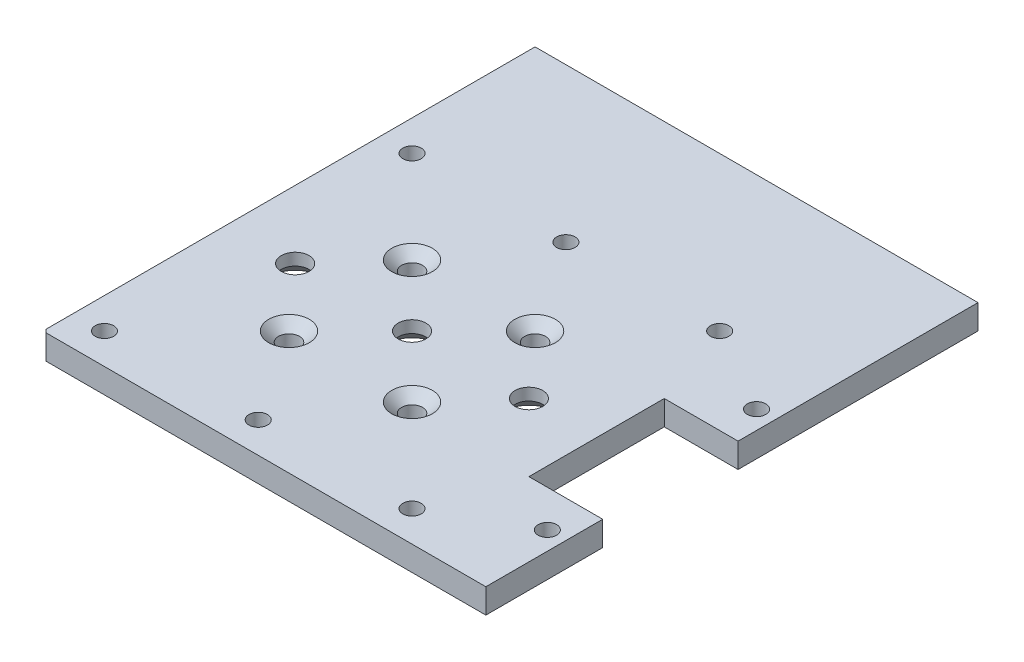
ISO-10303-21;
HEADER;
FILE_DESCRIPTION(('STEP AP214'),'2;1');
FILE_NAME('part.step','',(''),(''),'','','');
FILE_SCHEMA(('AUTOMOTIVE_DESIGN { 1 0 10303 214 1 1 1 1 }'));
ENDSEC;
DATA;
#1=APPLICATION_CONTEXT('core data for automotive mechanical design processes');
#2=APPLICATION_PROTOCOL_DEFINITION('international standard','automotive_design',2000,#1);
#3=PRODUCT_CONTEXT('',#1,'mechanical');
#4=PRODUCT('Part','Part','',(#3));
#5=PRODUCT_RELATED_PRODUCT_CATEGORY('part','',(#4));
#6=PRODUCT_DEFINITION_FORMATION('','',#4);
#7=PRODUCT_DEFINITION_CONTEXT('part definition',#1,'design');
#8=PRODUCT_DEFINITION('design','',#6,#7);
#9=PRODUCT_DEFINITION_SHAPE('','',#8);
#10=(LENGTH_UNIT() NAMED_UNIT(*) SI_UNIT(.MILLI.,.METRE.));
#11=(NAMED_UNIT(*) PLANE_ANGLE_UNIT() SI_UNIT($,.RADIAN.));
#12=(NAMED_UNIT(*) SI_UNIT($,.STERADIAN.) SOLID_ANGLE_UNIT());
#13=UNCERTAINTY_MEASURE_WITH_UNIT(LENGTH_MEASURE(1.E-05),#10,'distance_accuracy_value','');
#14=(GEOMETRIC_REPRESENTATION_CONTEXT(3) GLOBAL_UNCERTAINTY_ASSIGNED_CONTEXT((#13)) GLOBAL_UNIT_ASSIGNED_CONTEXT((#10,
#11,#12)) REPRESENTATION_CONTEXT('',''));
#15=CARTESIAN_POINT('',(0.,0.,0.));
#16=DIRECTION('',(0.,0.,1.));
#17=DIRECTION('',(1.,0.,0.));
#18=AXIS2_PLACEMENT_3D('',#15,#16,#17);
#19=CARTESIAN_POINT('',(30.,4.,30.));
#20=DIRECTION('',(-1.,0.,0.));
#21=DIRECTION('',(0.,0.,1.));
#22=AXIS2_PLACEMENT_3D('',#19,#20,#21);
#23=PLANE('',#22);
#24=DIRECTION('',(0.,1.,0.));
#25=VECTOR('',#24,1.);
#26=CARTESIAN_POINT('',(30.,-22.4722050542442,-11.));
#27=LINE('',#26,#25);
#28=CARTESIAN_POINT('',(30.,0.,-11.));
#29=VERTEX_POINT('',#28);
#30=CARTESIAN_POINT('',(30.,4.,-11.));
#31=VERTEX_POINT('',#30);
#32=EDGE_CURVE('E57',#29,#31,#27,.T.);
#33=ORIENTED_EDGE('',*,*,#32,.T.);
#34=DIRECTION('',(0.,0.,-1.));
#35=VECTOR('',#34,1.);
#36=CARTESIAN_POINT('',(30.,4.,30.));
#37=LINE('',#36,#35);
#38=CARTESIAN_POINT('',(30.,4.,11.));
#39=VERTEX_POINT('',#38);
#40=EDGE_CURVE('E281',#39,#31,#37,.T.);
#41=ORIENTED_EDGE('',*,*,#40,.F.);
#42=DIRECTION('',(0.,1.,0.));
#43=VECTOR('',#42,1.);
#44=CARTESIAN_POINT('',(30.,-22.4722050542442,11.));
#45=LINE('',#44,#43);
#46=CARTESIAN_POINT('',(30.,0.,11.));
#47=VERTEX_POINT('',#46);
#48=EDGE_CURVE('E173',#47,#39,#45,.T.);
#49=ORIENTED_EDGE('',*,*,#48,.F.);
#50=DIRECTION('',(0.,0.,-1.));
#51=VECTOR('',#50,1.);
#52=CARTESIAN_POINT('',(30.,0.,30.));
#53=LINE('',#52,#51);
#54=EDGE_CURVE('E62',#47,#29,#53,.T.);
#55=ORIENTED_EDGE('',*,*,#54,.T.);
#56=EDGE_LOOP('',(#33,#41,#49,#55));
#57=FACE_BOUND('',#56,.T.);
#58=ADVANCED_FACE('F41',(#57),#23,.F.);
#59=CARTESIAN_POINT('',(-30.,4.,30.));
#60=DIRECTION('',(1.,0.,0.));
#61=DIRECTION('',(0.,0.,-1.));
#62=AXIS2_PLACEMENT_3D('',#59,#60,#61);
#63=PLANE('',#62);
#64=DIRECTION('',(0.,0.,1.));
#65=VECTOR('',#64,1.);
#66=CARTESIAN_POINT('',(-30.,0.,30.));
#67=LINE('',#66,#65);
#68=CARTESIAN_POINT('',(-30.,0.,-50.));
#69=VERTEX_POINT('',#68);
#70=CARTESIAN_POINT('',(-30.,0.,29.5));
#71=VERTEX_POINT('',#70);
#72=EDGE_CURVE('E129',#69,#71,#67,.T.);
#73=ORIENTED_EDGE('',*,*,#72,.T.);
#74=DIRECTION('',(0.,1.,0.));
#75=VECTOR('',#74,1.);
#76=CARTESIAN_POINT('',(-30.,4.,29.5));
#77=LINE('',#76,#75);
#78=CARTESIAN_POINT('',(-30.,4.,29.5));
#79=VERTEX_POINT('',#78);
#80=EDGE_CURVE('E50',#71,#79,#77,.T.);
#81=ORIENTED_EDGE('',*,*,#80,.T.);
#82=DIRECTION('',(0.,0.,1.));
#83=VECTOR('',#82,1.);
#84=CARTESIAN_POINT('',(-30.,4.,30.));
#85=LINE('',#84,#83);
#86=CARTESIAN_POINT('',(-30.,4.,-50.));
#87=VERTEX_POINT('',#86);
#88=EDGE_CURVE('E283',#87,#79,#85,.T.);
#89=ORIENTED_EDGE('',*,*,#88,.F.);
#90=DIRECTION('',(0.,1.,0.));
#91=VECTOR('',#90,1.);
#92=CARTESIAN_POINT('',(-30.,4.,-50.));
#93=LINE('',#92,#91);
#94=EDGE_CURVE('E133',#69,#87,#93,.T.);
#95=ORIENTED_EDGE('',*,*,#94,.F.);
#96=EDGE_LOOP('',(#73,#81,#89,#95));
#97=FACE_BOUND('',#96,.T.);
#98=ADVANCED_FACE('F298',(#97),#63,.F.);
#99=CARTESIAN_POINT('',(-30.,4.,30.));
#100=DIRECTION('',(0.,0.,-1.));
#101=DIRECTION('',(-1.,0.,0.));
#102=AXIS2_PLACEMENT_3D('',#99,#100,#101);
#103=PLANE('',#102);
#104=DIRECTION('',(1.,0.,0.));
#105=VECTOR('',#104,1.);
#106=CARTESIAN_POINT('',(-30.,4.,30.));
#107=LINE('',#106,#105);
#108=CARTESIAN_POINT('',(-29.5,4.,30.));
#109=VERTEX_POINT('',#108);
#110=CARTESIAN_POINT('',(42.,4.,30.));
#111=VERTEX_POINT('',#110);
#112=EDGE_CURVE('E287',#109,#111,#107,.T.);
#113=ORIENTED_EDGE('',*,*,#112,.F.);
#114=DIRECTION('',(0.,-1.,0.));
#115=VECTOR('',#114,1.);
#116=CARTESIAN_POINT('',(-29.5,4.,30.));
#117=LINE('',#116,#115);
#118=CARTESIAN_POINT('',(-29.5,0.,30.));
#119=VERTEX_POINT('',#118);
#120=EDGE_CURVE('E289',#109,#119,#117,.T.);
#121=ORIENTED_EDGE('',*,*,#120,.T.);
#122=DIRECTION('',(1.,0.,0.));
#123=VECTOR('',#122,1.);
#124=CARTESIAN_POINT('',(-30.,0.,30.));
#125=LINE('',#124,#123);
#126=CARTESIAN_POINT('',(42.,0.,30.));
#127=VERTEX_POINT('',#126);
#128=EDGE_CURVE('E284',#119,#127,#125,.T.);
#129=ORIENTED_EDGE('',*,*,#128,.T.);
#130=DIRECTION('',(0.,1.,0.));
#131=VECTOR('',#130,1.);
#132=CARTESIAN_POINT('',(42.,-22.4722050542442,30.));
#133=LINE('',#132,#131);
#134=EDGE_CURVE('E167',#127,#111,#133,.T.);
#135=ORIENTED_EDGE('',*,*,#134,.T.);
#136=EDGE_LOOP('',(#113,#121,#129,#135));
#137=FACE_BOUND('',#136,.T.);
#138=ADVANCED_FACE('F307',(#137),#103,.F.);
#139=CARTESIAN_POINT('',(0.,4.,0.));
#140=DIRECTION('',(0.,-1.,0.));
#141=DIRECTION('',(0.,0.,-1.));
#142=AXIS2_PLACEMENT_3D('',#139,#140,#141);
#143=PLANE('',#142);
#144=CARTESIAN_POINT('',(25.,4.,-25.));
#145=DIRECTION('',(0.,1.,0.));
#146=DIRECTION('',(0.,0.,1.));
#147=AXIS2_PLACEMENT_3D('',#144,#145,#146);
#148=CIRCLE('',#147,1.50000000000001);
#149=CARTESIAN_POINT('',(25.,4.,-23.5));
#150=VERTEX_POINT('',#149);
#151=EDGE_CURVE('E170',#150,#150,#148,.T.);
#152=ORIENTED_EDGE('',*,*,#151,.F.);
#153=EDGE_LOOP('',(#152));
#154=FACE_BOUND('',#153,.T.);
#155=CARTESIAN_POINT('',(25.,4.,25.));
#156=DIRECTION('',(0.,1.,0.));
#157=DIRECTION('',(0.,0.,1.));
#158=AXIS2_PLACEMENT_3D('',#155,#156,#157);
#159=CIRCLE('',#158,1.50000000000001);
#160=CARTESIAN_POINT('',(25.,4.,26.5));
#161=VERTEX_POINT('',#160);
#162=EDGE_CURVE('E188',#161,#161,#159,.T.);
#163=ORIENTED_EDGE('',*,*,#162,.F.);
#164=EDGE_LOOP('',(#163));
#165=FACE_BOUND('',#164,.T.);
#166=CARTESIAN_POINT('',(0.,4.,25.));
#167=DIRECTION('',(0.,1.,0.));
#168=DIRECTION('',(0.,0.,1.));
#169=AXIS2_PLACEMENT_3D('',#166,#167,#168);
#170=CIRCLE('',#169,1.50000000000001);
#171=CARTESIAN_POINT('',(0.,4.,26.5));
#172=VERTEX_POINT('',#171);
#173=EDGE_CURVE('E194',#172,#172,#170,.T.);
#174=ORIENTED_EDGE('',*,*,#173,.F.);
#175=EDGE_LOOP('',(#174));
#176=FACE_BOUND('',#175,.T.);
#177=CARTESIAN_POINT('',(-25.,4.,25.));
#178=DIRECTION('',(0.,1.,0.));
#179=DIRECTION('',(0.,0.,1.));
#180=AXIS2_PLACEMENT_3D('',#177,#178,#179);
#181=CIRCLE('',#180,1.50000000000001);
#182=CARTESIAN_POINT('',(-25.,4.,26.5));
#183=VERTEX_POINT('',#182);
#184=EDGE_CURVE('E200',#183,#183,#181,.T.);
#185=ORIENTED_EDGE('',*,*,#184,.F.);
#186=EDGE_LOOP('',(#185));
#187=FACE_BOUND('',#186,.T.);
#188=CARTESIAN_POINT('',(-25.,4.,-25.));
#189=DIRECTION('',(0.,1.,0.));
#190=DIRECTION('',(0.,0.,1.));
#191=AXIS2_PLACEMENT_3D('',#188,#189,#190);
#192=CIRCLE('',#191,1.50000000000001);
#193=CARTESIAN_POINT('',(-25.,4.,-23.5));
#194=VERTEX_POINT('',#193);
#195=EDGE_CURVE('E206',#194,#194,#192,.T.);
#196=ORIENTED_EDGE('',*,*,#195,.F.);
#197=EDGE_LOOP('',(#196));
#198=FACE_BOUND('',#197,.T.);
#199=CARTESIAN_POINT('',(0.,4.,-25.));
#200=DIRECTION('',(0.,1.,0.));
#201=DIRECTION('',(0.,0.,1.));
#202=AXIS2_PLACEMENT_3D('',#199,#200,#201);
#203=CIRCLE('',#202,1.50000000000001);
#204=CARTESIAN_POINT('',(0.,4.,-23.5));
#205=VERTEX_POINT('',#204);
#206=EDGE_CURVE('E212',#205,#205,#203,.T.);
#207=ORIENTED_EDGE('',*,*,#206,.F.);
#208=EDGE_LOOP('',(#207));
#209=FACE_BOUND('',#208,.T.);
#210=CARTESIAN_POINT('',(-19.,4.,0.));
#211=DIRECTION('',(0.,-1.,0.));
#212=DIRECTION('',(0.,0.,-1.));
#213=AXIS2_PLACEMENT_3D('',#210,#211,#212);
#214=CIRCLE('',#213,2.25);
#215=CARTESIAN_POINT('',(-19.,4.,-2.25));
#216=VERTEX_POINT('',#215);
#217=EDGE_CURVE('E224',#216,#216,#214,.T.);
#218=ORIENTED_EDGE('',*,*,#217,.T.);
#219=EDGE_LOOP('',(#218));
#220=FACE_BOUND('',#219,.T.);
#221=CARTESIAN_POINT('',(0.,4.,0.));
#222=DIRECTION('',(0.,-1.,0.));
#223=DIRECTION('',(0.,0.,-1.));
#224=AXIS2_PLACEMENT_3D('',#221,#222,#223);
#225=CIRCLE('',#224,2.25);
#226=CARTESIAN_POINT('',(0.,4.,-2.25));
#227=VERTEX_POINT('',#226);
#228=EDGE_CURVE('E233',#227,#227,#225,.T.);
#229=ORIENTED_EDGE('',*,*,#228,.T.);
#230=EDGE_LOOP('',(#229));
#231=FACE_BOUND('',#230,.T.);
#232=CARTESIAN_POINT('',(19.,4.,0.));
#233=DIRECTION('',(0.,-1.,0.));
#234=DIRECTION('',(0.,0.,-1.));
#235=AXIS2_PLACEMENT_3D('',#232,#233,#234);
#236=CIRCLE('',#235,2.25);
#237=CARTESIAN_POINT('',(19.,4.,-2.25));
#238=VERTEX_POINT('',#237);
#239=EDGE_CURVE('E242',#238,#238,#236,.T.);
#240=ORIENTED_EDGE('',*,*,#239,.T.);
#241=EDGE_LOOP('',(#240));
#242=FACE_BOUND('',#241,.T.);
#243=CARTESIAN_POINT('',(-10.,4.,-10.));
#244=DIRECTION('',(0.,1.,0.));
#245=DIRECTION('',(0.,0.,1.));
#246=AXIS2_PLACEMENT_3D('',#243,#244,#245);
#247=CIRCLE('',#246,3.3);
#248=CARTESIAN_POINT('',(-10.,4.,-6.7));
#249=VERTEX_POINT('',#248);
#250=EDGE_CURVE('E245',#249,#249,#247,.T.);
#251=ORIENTED_EDGE('',*,*,#250,.F.);
#252=EDGE_LOOP('',(#251));
#253=FACE_BOUND('',#252,.T.);
#254=CARTESIAN_POINT('',(10.,4.,-10.0000000000006));
#255=DIRECTION('',(0.,1.,0.));
#256=DIRECTION('',(0.,0.,1.));
#257=AXIS2_PLACEMENT_3D('',#254,#255,#256);
#258=CIRCLE('',#257,3.3);
#259=CARTESIAN_POINT('',(10.,4.,-6.70000000000057));
#260=VERTEX_POINT('',#259);
#261=EDGE_CURVE('E254',#260,#260,#258,.T.);
#262=ORIENTED_EDGE('',*,*,#261,.F.);
#263=EDGE_LOOP('',(#262));
#264=FACE_BOUND('',#263,.T.);
#265=CARTESIAN_POINT('',(10.0000000000006,4.,9.99999999999944));
#266=DIRECTION('',(0.,1.,0.));
#267=DIRECTION('',(0.,0.,1.));
#268=AXIS2_PLACEMENT_3D('',#265,#266,#267);
#269=CIRCLE('',#268,3.3);
#270=CARTESIAN_POINT('',(10.0000000000006,4.,13.2999999999994));
#271=VERTEX_POINT('',#270);
#272=EDGE_CURVE('E263',#271,#271,#269,.T.);
#273=ORIENTED_EDGE('',*,*,#272,.F.);
#274=EDGE_LOOP('',(#273));
#275=FACE_BOUND('',#274,.T.);
#276=CARTESIAN_POINT('',(-9.99999999999944,4.,10.));
#277=DIRECTION('',(0.,1.,0.));
#278=DIRECTION('',(0.,0.,1.));
#279=AXIS2_PLACEMENT_3D('',#276,#277,#278);
#280=CIRCLE('',#279,3.3);
#281=CARTESIAN_POINT('',(-9.99999999999944,4.,13.3));
#282=VERTEX_POINT('',#281);
#283=EDGE_CURVE('E272',#282,#282,#280,.T.);
#284=ORIENTED_EDGE('',*,*,#283,.F.);
#285=EDGE_LOOP('',(#284));
#286=FACE_BOUND('',#285,.T.);
#287=ORIENTED_EDGE('',*,*,#88,.T.);
#288=DIRECTION('',(-0.707106781186548,0.,-0.707106781186548));
#289=VECTOR('',#288,1.);
#290=CARTESIAN_POINT('',(-29.5,4.,30.));
#291=LINE('',#290,#289);
#292=EDGE_CURVE('E11',#79,#109,#291,.F.);
#293=ORIENTED_EDGE('',*,*,#292,.T.);
#294=ORIENTED_EDGE('',*,*,#112,.T.);
#295=DIRECTION('',(0.,0.,-1.));
#296=VECTOR('',#295,1.);
#297=CARTESIAN_POINT('',(42.,4.,30.));
#298=LINE('',#297,#296);
#299=CARTESIAN_POINT('',(42.,4.,11.));
#300=VERTEX_POINT('',#299);
#301=EDGE_CURVE('E161',#111,#300,#298,.T.);
#302=ORIENTED_EDGE('',*,*,#301,.T.);
#303=DIRECTION('',(-1.,0.,0.));
#304=VECTOR('',#303,1.);
#305=CARTESIAN_POINT('',(30.,4.,11.));
#306=LINE('',#305,#304);
#307=EDGE_CURVE('E157',#300,#39,#306,.T.);
#308=ORIENTED_EDGE('',*,*,#307,.T.);
#309=ORIENTED_EDGE('',*,*,#40,.T.);
#310=DIRECTION('',(-1.,0.,0.));
#311=VECTOR('',#310,1.);
#312=CARTESIAN_POINT('',(30.,4.,-11.));
#313=LINE('',#312,#311);
#314=CARTESIAN_POINT('',(42.,4.,-11.));
#315=VERTEX_POINT('',#314);
#316=EDGE_CURVE('E147',#315,#31,#313,.T.);
#317=ORIENTED_EDGE('',*,*,#316,.F.);
#318=DIRECTION('',(0.,0.,1.));
#319=VECTOR('',#318,1.);
#320=CARTESIAN_POINT('',(42.,4.,-30.));
#321=LINE('',#320,#319);
#322=CARTESIAN_POINT('',(42.,4.,-50.));
#323=VERTEX_POINT('',#322);
#324=EDGE_CURVE('E150',#323,#315,#321,.T.);
#325=ORIENTED_EDGE('',*,*,#324,.F.);
#326=DIRECTION('',(1.,0.,0.));
#327=VECTOR('',#326,1.);
#328=CARTESIAN_POINT('',(42.,4.,-50.));
#329=LINE('',#328,#327);
#330=EDGE_CURVE('E138',#87,#323,#329,.T.);
#331=ORIENTED_EDGE('',*,*,#330,.F.);
#332=EDGE_LOOP('',(#287,#293,#294,#302,#308,#309,#317,#325,#331));
#333=FACE_BOUND('',#332,.T.);
#334=CARTESIAN_POINT('',(39.,4.,17.));
#335=DIRECTION('',(0.,1.,0.));
#336=DIRECTION('',(0.,0.,1.));
#337=AXIS2_PLACEMENT_3D('',#334,#335,#336);
#338=CIRCLE('',#337,1.5);
#339=CARTESIAN_POINT('',(39.,4.,18.5));
#340=VERTEX_POINT('',#339);
#341=EDGE_CURVE('E164',#340,#340,#338,.T.);
#342=ORIENTED_EDGE('',*,*,#341,.F.);
#343=EDGE_LOOP('',(#342));
#344=FACE_BOUND('',#343,.T.);
#345=CARTESIAN_POINT('',(39.,4.,-17.));
#346=DIRECTION('',(0.,-1.,0.));
#347=DIRECTION('',(0.,0.,-1.));
#348=AXIS2_PLACEMENT_3D('',#345,#346,#347);
#349=CIRCLE('',#348,1.5);
#350=CARTESIAN_POINT('',(39.,4.,-18.5));
#351=VERTEX_POINT('',#350);
#352=EDGE_CURVE('E120',#351,#351,#349,.T.);
#353=ORIENTED_EDGE('',*,*,#352,.T.);
#354=EDGE_LOOP('',(#353));
#355=FACE_BOUND('',#354,.T.);
#356=ADVANCED_FACE('F302',(#154,#165,#176,#187,#198,#209,#220,#231,#242,#253,#264,#275,#286,
#333,#344,#355),#143,.F.);
#357=CARTESIAN_POINT('',(0.,0.,0.));
#358=DIRECTION('',(0.,-1.,0.));
#359=DIRECTION('',(0.,0.,-1.));
#360=AXIS2_PLACEMENT_3D('',#357,#358,#359);
#361=PLANE('',#360);
#362=CARTESIAN_POINT('',(25.,0.,-25.));
#363=DIRECTION('',(0.,1.,0.));
#364=DIRECTION('',(0.,0.,1.));
#365=AXIS2_PLACEMENT_3D('',#362,#363,#364);
#366=CIRCLE('',#365,1.50000000000001);
#367=CARTESIAN_POINT('',(25.,0.,-23.5));
#368=VERTEX_POINT('',#367);
#369=EDGE_CURVE('E185',#368,#368,#366,.T.);
#370=ORIENTED_EDGE('',*,*,#369,.T.);
#371=EDGE_LOOP('',(#370));
#372=FACE_BOUND('',#371,.T.);
#373=CARTESIAN_POINT('',(25.,0.,25.));
#374=DIRECTION('',(0.,1.,0.));
#375=DIRECTION('',(0.,0.,1.));
#376=AXIS2_PLACEMENT_3D('',#373,#374,#375);
#377=CIRCLE('',#376,1.50000000000001);
#378=CARTESIAN_POINT('',(25.,0.,26.5));
#379=VERTEX_POINT('',#378);
#380=EDGE_CURVE('E191',#379,#379,#377,.T.);
#381=ORIENTED_EDGE('',*,*,#380,.T.);
#382=EDGE_LOOP('',(#381));
#383=FACE_BOUND('',#382,.T.);
#384=CARTESIAN_POINT('',(0.,0.,25.));
#385=DIRECTION('',(0.,1.,0.));
#386=DIRECTION('',(0.,0.,1.));
#387=AXIS2_PLACEMENT_3D('',#384,#385,#386);
#388=CIRCLE('',#387,1.50000000000001);
#389=CARTESIAN_POINT('',(0.,0.,26.5));
#390=VERTEX_POINT('',#389);
#391=EDGE_CURVE('E197',#390,#390,#388,.T.);
#392=ORIENTED_EDGE('',*,*,#391,.T.);
#393=EDGE_LOOP('',(#392));
#394=FACE_BOUND('',#393,.T.);
#395=CARTESIAN_POINT('',(-25.,0.,25.));
#396=DIRECTION('',(0.,1.,0.));
#397=DIRECTION('',(0.,0.,1.));
#398=AXIS2_PLACEMENT_3D('',#395,#396,#397);
#399=CIRCLE('',#398,1.50000000000001);
#400=CARTESIAN_POINT('',(-25.,0.,26.5));
#401=VERTEX_POINT('',#400);
#402=EDGE_CURVE('E203',#401,#401,#399,.T.);
#403=ORIENTED_EDGE('',*,*,#402,.T.);
#404=EDGE_LOOP('',(#403));
#405=FACE_BOUND('',#404,.T.);
#406=CARTESIAN_POINT('',(-25.,0.,-25.));
#407=DIRECTION('',(0.,1.,0.));
#408=DIRECTION('',(0.,0.,1.));
#409=AXIS2_PLACEMENT_3D('',#406,#407,#408);
#410=CIRCLE('',#409,1.50000000000001);
#411=CARTESIAN_POINT('',(-25.,0.,-23.5));
#412=VERTEX_POINT('',#411);
#413=EDGE_CURVE('E209',#412,#412,#410,.T.);
#414=ORIENTED_EDGE('',*,*,#413,.T.);
#415=EDGE_LOOP('',(#414));
#416=FACE_BOUND('',#415,.T.);
#417=CARTESIAN_POINT('',(0.,0.,-25.));
#418=DIRECTION('',(0.,1.,0.));
#419=DIRECTION('',(0.,0.,1.));
#420=AXIS2_PLACEMENT_3D('',#417,#418,#419);
#421=CIRCLE('',#420,1.50000000000001);
#422=CARTESIAN_POINT('',(0.,0.,-23.5));
#423=VERTEX_POINT('',#422);
#424=EDGE_CURVE('E215',#423,#423,#421,.T.);
#425=ORIENTED_EDGE('',*,*,#424,.T.);
#426=EDGE_LOOP('',(#425));
#427=FACE_BOUND('',#426,.T.);
#428=CARTESIAN_POINT('',(-19.,0.,0.));
#429=DIRECTION('',(0.,-1.,0.));
#430=DIRECTION('',(0.,0.,-1.));
#431=AXIS2_PLACEMENT_3D('',#428,#429,#430);
#432=CIRCLE('',#431,4.3);
#433=CARTESIAN_POINT('',(-19.,0.,-4.3));
#434=VERTEX_POINT('',#433);
#435=EDGE_CURVE('E218',#434,#434,#432,.T.);
#436=ORIENTED_EDGE('',*,*,#435,.F.);
#437=EDGE_LOOP('',(#436));
#438=FACE_BOUND('',#437,.T.);
#439=CARTESIAN_POINT('',(0.,0.,0.));
#440=DIRECTION('',(0.,-1.,0.));
#441=DIRECTION('',(0.,0.,-1.));
#442=AXIS2_PLACEMENT_3D('',#439,#440,#441);
#443=CIRCLE('',#442,4.3);
#444=CARTESIAN_POINT('',(0.,0.,-4.3));
#445=VERTEX_POINT('',#444);
#446=EDGE_CURVE('E227',#445,#445,#443,.T.);
#447=ORIENTED_EDGE('',*,*,#446,.F.);
#448=EDGE_LOOP('',(#447));
#449=FACE_BOUND('',#448,.T.);
#450=CARTESIAN_POINT('',(19.,0.,0.));
#451=DIRECTION('',(0.,-1.,0.));
#452=DIRECTION('',(0.,0.,-1.));
#453=AXIS2_PLACEMENT_3D('',#450,#451,#452);
#454=CIRCLE('',#453,4.3);
#455=CARTESIAN_POINT('',(19.,0.,-4.3));
#456=VERTEX_POINT('',#455);
#457=EDGE_CURVE('E236',#456,#456,#454,.T.);
#458=ORIENTED_EDGE('',*,*,#457,.F.);
#459=EDGE_LOOP('',(#458));
#460=FACE_BOUND('',#459,.T.);
#461=CARTESIAN_POINT('',(-10.,0.,-10.));
#462=DIRECTION('',(0.,1.,0.));
#463=DIRECTION('',(0.,0.,1.));
#464=AXIS2_PLACEMENT_3D('',#461,#462,#463);
#465=CIRCLE('',#464,1.7);
#466=CARTESIAN_POINT('',(-10.,0.,-8.3));
#467=VERTEX_POINT('',#466);
#468=EDGE_CURVE('E251',#467,#467,#465,.T.);
#469=ORIENTED_EDGE('',*,*,#468,.T.);
#470=EDGE_LOOP('',(#469));
#471=FACE_BOUND('',#470,.T.);
#472=CARTESIAN_POINT('',(10.,0.,-10.0000000000006));
#473=DIRECTION('',(0.,1.,0.));
#474=DIRECTION('',(0.,0.,1.));
#475=AXIS2_PLACEMENT_3D('',#472,#473,#474);
#476=CIRCLE('',#475,1.7);
#477=CARTESIAN_POINT('',(10.,0.,-8.30000000000057));
#478=VERTEX_POINT('',#477);
#479=EDGE_CURVE('E260',#478,#478,#476,.T.);
#480=ORIENTED_EDGE('',*,*,#479,.T.);
#481=EDGE_LOOP('',(#480));
#482=FACE_BOUND('',#481,.T.);
#483=CARTESIAN_POINT('',(10.0000000000006,0.,9.99999999999944));
#484=DIRECTION('',(0.,1.,0.));
#485=DIRECTION('',(0.,0.,1.));
#486=AXIS2_PLACEMENT_3D('',#483,#484,#485);
#487=CIRCLE('',#486,1.7);
#488=CARTESIAN_POINT('',(10.0000000000006,0.,11.6999999999994));
#489=VERTEX_POINT('',#488);
#490=EDGE_CURVE('E269',#489,#489,#487,.T.);
#491=ORIENTED_EDGE('',*,*,#490,.T.);
#492=EDGE_LOOP('',(#491));
#493=FACE_BOUND('',#492,.T.);
#494=CARTESIAN_POINT('',(-9.99999999999944,0.,10.));
#495=DIRECTION('',(0.,1.,0.));
#496=DIRECTION('',(0.,0.,1.));
#497=AXIS2_PLACEMENT_3D('',#494,#495,#496);
#498=CIRCLE('',#497,1.7);
#499=CARTESIAN_POINT('',(-9.99999999999944,0.,11.7));
#500=VERTEX_POINT('',#499);
#501=EDGE_CURVE('E278',#500,#500,#498,.T.);
#502=ORIENTED_EDGE('',*,*,#501,.T.);
#503=EDGE_LOOP('',(#502));
#504=FACE_BOUND('',#503,.T.);
#505=ORIENTED_EDGE('',*,*,#128,.F.);
#506=DIRECTION('',(0.707106781186548,0.,0.707106781186548));
#507=VECTOR('',#506,1.);
#508=CARTESIAN_POINT('',(-29.75,0.,29.75));
#509=LINE('',#508,#507);
#510=EDGE_CURVE('E295',#119,#71,#509,.F.);
#511=ORIENTED_EDGE('',*,*,#510,.T.);
#512=ORIENTED_EDGE('',*,*,#72,.F.);
#513=DIRECTION('',(-1.,0.,0.));
#514=VECTOR('',#513,1.);
#515=CARTESIAN_POINT('',(42.,0.,-50.));
#516=LINE('',#515,#514);
#517=CARTESIAN_POINT('',(42.,0.,-50.));
#518=VERTEX_POINT('',#517);
#519=EDGE_CURVE('E124',#518,#69,#516,.T.);
#520=ORIENTED_EDGE('',*,*,#519,.F.);
#521=DIRECTION('',(0.,0.,1.));
#522=VECTOR('',#521,1.);
#523=CARTESIAN_POINT('',(42.,0.,-30.));
#524=LINE('',#523,#522);
#525=CARTESIAN_POINT('',(42.,0.,-11.));
#526=VERTEX_POINT('',#525);
#527=EDGE_CURVE('E110',#518,#526,#524,.T.);
#528=ORIENTED_EDGE('',*,*,#527,.T.);
#529=DIRECTION('',(-1.,0.,0.));
#530=VECTOR('',#529,1.);
#531=CARTESIAN_POINT('',(30.,0.,-11.));
#532=LINE('',#531,#530);
#533=EDGE_CURVE('E121',#526,#29,#532,.T.);
#534=ORIENTED_EDGE('',*,*,#533,.T.);
#535=ORIENTED_EDGE('',*,*,#54,.F.);
#536=DIRECTION('',(-1.,0.,0.));
#537=VECTOR('',#536,1.);
#538=CARTESIAN_POINT('',(30.,0.,11.));
#539=LINE('',#538,#537);
#540=CARTESIAN_POINT('',(42.,0.,11.));
#541=VERTEX_POINT('',#540);
#542=EDGE_CURVE('E153',#541,#47,#539,.T.);
#543=ORIENTED_EDGE('',*,*,#542,.F.);
#544=DIRECTION('',(0.,0.,-1.));
#545=VECTOR('',#544,1.);
#546=CARTESIAN_POINT('',(42.,0.,30.));
#547=LINE('',#546,#545);
#548=EDGE_CURVE('E174',#127,#541,#547,.T.);
#549=ORIENTED_EDGE('',*,*,#548,.F.);
#550=EDGE_LOOP('',(#505,#511,#512,#520,#528,#534,#535,#543,#549));
#551=FACE_BOUND('',#550,.T.);
#552=CARTESIAN_POINT('',(39.,0.,17.));
#553=DIRECTION('',(0.,-1.,0.));
#554=DIRECTION('',(0.,0.,-1.));
#555=AXIS2_PLACEMENT_3D('',#552,#553,#554);
#556=CIRCLE('',#555,1.5);
#557=CARTESIAN_POINT('',(39.,0.,15.5));
#558=VERTEX_POINT('',#557);
#559=EDGE_CURVE('E160',#558,#558,#556,.F.);
#560=ORIENTED_EDGE('',*,*,#559,.T.);
#561=EDGE_LOOP('',(#560));
#562=FACE_BOUND('',#561,.T.);
#563=CARTESIAN_POINT('',(39.,0.,-17.));
#564=DIRECTION('',(0.,-1.,0.));
#565=DIRECTION('',(0.,0.,-1.));
#566=AXIS2_PLACEMENT_3D('',#563,#564,#565);
#567=CIRCLE('',#566,1.5);
#568=CARTESIAN_POINT('',(39.,0.,-18.5));
#569=VERTEX_POINT('',#568);
#570=EDGE_CURVE('E143',#569,#569,#567,.T.);
#571=ORIENTED_EDGE('',*,*,#570,.F.);
#572=EDGE_LOOP('',(#571));
#573=FACE_BOUND('',#572,.T.);
#574=ADVANCED_FACE('F126',(#372,#383,#394,#405,#416,#427,#438,#449,#460,#471,#482,#493,#504,
#551,#562,#573),#361,.T.);
#575=CARTESIAN_POINT('',(-9.99999999999944,4.,10.));
#576=DIRECTION('',(0.,1.,0.));
#577=DIRECTION('',(0.,0.,1.));
#578=AXIS2_PLACEMENT_3D('',#575,#576,#577);
#579=CYLINDRICAL_SURFACE('',#578,1.7);
#580=ORIENTED_EDGE('',*,*,#501,.F.);
#581=EDGE_LOOP('',(#580));
#582=FACE_BOUND('',#581,.T.);
#583=CARTESIAN_POINT('',(-9.99999999999944,2.4,10.));
#584=DIRECTION('',(0.,1.,0.));
#585=DIRECTION('',(0.,0.,1.));
#586=AXIS2_PLACEMENT_3D('',#583,#584,#585);
#587=CIRCLE('',#586,1.7);
#588=CARTESIAN_POINT('',(-9.99999999999944,2.4,11.7));
#589=VERTEX_POINT('',#588);
#590=EDGE_CURVE('E275',#589,#589,#587,.T.);
#591=ORIENTED_EDGE('',*,*,#590,.T.);
#592=EDGE_LOOP('',(#591));
#593=FACE_BOUND('',#592,.T.);
#594=ADVANCED_FACE('F340',(#582,#593),#579,.F.);
#595=CARTESIAN_POINT('',(-9.99999999999944,4.,10.));
#596=DIRECTION('',(0.,1.,0.));
#597=DIRECTION('',(0.,0.,1.));
#598=AXIS2_PLACEMENT_3D('',#595,#596,#597);
#599=CONICAL_SURFACE('',#598,3.3,0.785398163397449);
#600=ORIENTED_EDGE('',*,*,#590,.F.);
#601=EDGE_LOOP('',(#600));
#602=FACE_BOUND('',#601,.T.);
#603=ORIENTED_EDGE('',*,*,#283,.T.);
#604=EDGE_LOOP('',(#603));
#605=FACE_BOUND('',#604,.T.);
#606=ADVANCED_FACE('F347',(#602,#605),#599,.F.);
#607=CARTESIAN_POINT('',(10.0000000000006,4.,9.99999999999944));
#608=DIRECTION('',(0.,1.,0.));
#609=DIRECTION('',(0.,0.,1.));
#610=AXIS2_PLACEMENT_3D('',#607,#608,#609);
#611=CYLINDRICAL_SURFACE('',#610,1.7);
#612=ORIENTED_EDGE('',*,*,#490,.F.);
#613=EDGE_LOOP('',(#612));
#614=FACE_BOUND('',#613,.T.);
#615=CARTESIAN_POINT('',(10.0000000000006,2.4,9.99999999999944));
#616=DIRECTION('',(0.,1.,0.));
#617=DIRECTION('',(0.,0.,1.));
#618=AXIS2_PLACEMENT_3D('',#615,#616,#617);
#619=CIRCLE('',#618,1.7);
#620=CARTESIAN_POINT('',(10.0000000000006,2.4,11.6999999999994));
#621=VERTEX_POINT('',#620);
#622=EDGE_CURVE('E266',#621,#621,#619,.T.);
#623=ORIENTED_EDGE('',*,*,#622,.T.);
#624=EDGE_LOOP('',(#623));
#625=FACE_BOUND('',#624,.T.);
#626=ADVANCED_FACE('F351',(#614,#625),#611,.F.);
#627=CARTESIAN_POINT('',(10.0000000000006,4.,9.99999999999944));
#628=DIRECTION('',(0.,1.,0.));
#629=DIRECTION('',(0.,0.,1.));
#630=AXIS2_PLACEMENT_3D('',#627,#628,#629);
#631=CONICAL_SURFACE('',#630,3.3,0.785398163397449);
#632=ORIENTED_EDGE('',*,*,#622,.F.);
#633=EDGE_LOOP('',(#632));
#634=FACE_BOUND('',#633,.T.);
#635=ORIENTED_EDGE('',*,*,#272,.T.);
#636=EDGE_LOOP('',(#635));
#637=FACE_BOUND('',#636,.T.);
#638=ADVANCED_FACE('F355',(#634,#637),#631,.F.);
#639=CARTESIAN_POINT('',(10.,4.,-10.0000000000006));
#640=DIRECTION('',(0.,1.,0.));
#641=DIRECTION('',(0.,0.,1.));
#642=AXIS2_PLACEMENT_3D('',#639,#640,#641);
#643=CYLINDRICAL_SURFACE('',#642,1.7);
#644=ORIENTED_EDGE('',*,*,#479,.F.);
#645=EDGE_LOOP('',(#644));
#646=FACE_BOUND('',#645,.T.);
#647=CARTESIAN_POINT('',(10.,2.4,-10.0000000000006));
#648=DIRECTION('',(0.,1.,0.));
#649=DIRECTION('',(0.,0.,1.));
#650=AXIS2_PLACEMENT_3D('',#647,#648,#649);
#651=CIRCLE('',#650,1.7);
#652=CARTESIAN_POINT('',(10.,2.4,-8.30000000000057));
#653=VERTEX_POINT('',#652);
#654=EDGE_CURVE('E257',#653,#653,#651,.T.);
#655=ORIENTED_EDGE('',*,*,#654,.T.);
#656=EDGE_LOOP('',(#655));
#657=FACE_BOUND('',#656,.T.);
#658=ADVANCED_FACE('F359',(#646,#657),#643,.F.);
#659=CARTESIAN_POINT('',(10.,4.,-10.0000000000006));
#660=DIRECTION('',(0.,1.,0.));
#661=DIRECTION('',(0.,0.,1.));
#662=AXIS2_PLACEMENT_3D('',#659,#660,#661);
#663=CONICAL_SURFACE('',#662,3.3,0.785398163397449);
#664=ORIENTED_EDGE('',*,*,#654,.F.);
#665=EDGE_LOOP('',(#664));
#666=FACE_BOUND('',#665,.T.);
#667=ORIENTED_EDGE('',*,*,#261,.T.);
#668=EDGE_LOOP('',(#667));
#669=FACE_BOUND('',#668,.T.);
#670=ADVANCED_FACE('F363',(#666,#669),#663,.F.);
#671=CARTESIAN_POINT('',(-10.,4.,-10.));
#672=DIRECTION('',(0.,1.,0.));
#673=DIRECTION('',(0.,0.,1.));
#674=AXIS2_PLACEMENT_3D('',#671,#672,#673);
#675=CYLINDRICAL_SURFACE('',#674,1.7);
#676=ORIENTED_EDGE('',*,*,#468,.F.);
#677=EDGE_LOOP('',(#676));
#678=FACE_BOUND('',#677,.T.);
#679=CARTESIAN_POINT('',(-10.,2.4,-10.));
#680=DIRECTION('',(0.,1.,0.));
#681=DIRECTION('',(0.,0.,1.));
#682=AXIS2_PLACEMENT_3D('',#679,#680,#681);
#683=CIRCLE('',#682,1.7);
#684=CARTESIAN_POINT('',(-10.,2.4,-8.3));
#685=VERTEX_POINT('',#684);
#686=EDGE_CURVE('E248',#685,#685,#683,.T.);
#687=ORIENTED_EDGE('',*,*,#686,.T.);
#688=EDGE_LOOP('',(#687));
#689=FACE_BOUND('',#688,.T.);
#690=ADVANCED_FACE('F367',(#678,#689),#675,.F.);
#691=CARTESIAN_POINT('',(-10.,4.,-10.));
#692=DIRECTION('',(0.,1.,0.));
#693=DIRECTION('',(0.,0.,1.));
#694=AXIS2_PLACEMENT_3D('',#691,#692,#693);
#695=CONICAL_SURFACE('',#694,3.3,0.785398163397449);
#696=ORIENTED_EDGE('',*,*,#686,.F.);
#697=EDGE_LOOP('',(#696));
#698=FACE_BOUND('',#697,.T.);
#699=ORIENTED_EDGE('',*,*,#250,.T.);
#700=EDGE_LOOP('',(#699));
#701=FACE_BOUND('',#700,.T.);
#702=ADVANCED_FACE('F371',(#698,#701),#695,.F.);
#703=CARTESIAN_POINT('',(19.,0.,0.));
#704=DIRECTION('',(0.,-1.,0.));
#705=DIRECTION('',(0.,0.,-1.));
#706=AXIS2_PLACEMENT_3D('',#703,#704,#705);
#707=CYLINDRICAL_SURFACE('',#706,2.25);
#708=ORIENTED_EDGE('',*,*,#239,.F.);
#709=EDGE_LOOP('',(#708));
#710=FACE_BOUND('',#709,.T.);
#711=CARTESIAN_POINT('',(19.,2.05,0.));
#712=DIRECTION('',(0.,-1.,0.));
#713=DIRECTION('',(0.,0.,-1.));
#714=AXIS2_PLACEMENT_3D('',#711,#712,#713);
#715=CIRCLE('',#714,2.25);
#716=CARTESIAN_POINT('',(19.,2.05,-2.25));
#717=VERTEX_POINT('',#716);
#718=EDGE_CURVE('E239',#717,#717,#715,.T.);
#719=ORIENTED_EDGE('',*,*,#718,.T.);
#720=EDGE_LOOP('',(#719));
#721=FACE_BOUND('',#720,.T.);
#722=ADVANCED_FACE('F375',(#710,#721),#707,.F.);
#723=CARTESIAN_POINT('',(19.,0.,0.));
#724=DIRECTION('',(0.,-1.,0.));
#725=DIRECTION('',(0.,0.,-1.));
#726=AXIS2_PLACEMENT_3D('',#723,#724,#725);
#727=CONICAL_SURFACE('',#726,4.3,0.785398163397449);
#728=ORIENTED_EDGE('',*,*,#718,.F.);
#729=EDGE_LOOP('',(#728));
#730=FACE_BOUND('',#729,.T.);
#731=ORIENTED_EDGE('',*,*,#457,.T.);
#732=EDGE_LOOP('',(#731));
#733=FACE_BOUND('',#732,.T.);
#734=ADVANCED_FACE('F379',(#730,#733),#727,.F.);
#735=CARTESIAN_POINT('',(0.,0.,0.));
#736=DIRECTION('',(0.,-1.,0.));
#737=DIRECTION('',(0.,0.,-1.));
#738=AXIS2_PLACEMENT_3D('',#735,#736,#737);
#739=CYLINDRICAL_SURFACE('',#738,2.25);
#740=ORIENTED_EDGE('',*,*,#228,.F.);
#741=EDGE_LOOP('',(#740));
#742=FACE_BOUND('',#741,.T.);
#743=CARTESIAN_POINT('',(0.,2.05,0.));
#744=DIRECTION('',(0.,-1.,0.));
#745=DIRECTION('',(0.,0.,-1.));
#746=AXIS2_PLACEMENT_3D('',#743,#744,#745);
#747=CIRCLE('',#746,2.25);
#748=CARTESIAN_POINT('',(0.,2.05,-2.25));
#749=VERTEX_POINT('',#748);
#750=EDGE_CURVE('E230',#749,#749,#747,.T.);
#751=ORIENTED_EDGE('',*,*,#750,.T.);
#752=EDGE_LOOP('',(#751));
#753=FACE_BOUND('',#752,.T.);
#754=ADVANCED_FACE('F383',(#742,#753),#739,.F.);
#755=CARTESIAN_POINT('',(0.,0.,0.));
#756=DIRECTION('',(0.,-1.,0.));
#757=DIRECTION('',(0.,0.,-1.));
#758=AXIS2_PLACEMENT_3D('',#755,#756,#757);
#759=CONICAL_SURFACE('',#758,4.3,0.785398163397449);
#760=ORIENTED_EDGE('',*,*,#750,.F.);
#761=EDGE_LOOP('',(#760));
#762=FACE_BOUND('',#761,.T.);
#763=ORIENTED_EDGE('',*,*,#446,.T.);
#764=EDGE_LOOP('',(#763));
#765=FACE_BOUND('',#764,.T.);
#766=ADVANCED_FACE('F387',(#762,#765),#759,.F.);
#767=CARTESIAN_POINT('',(-19.,0.,0.));
#768=DIRECTION('',(0.,-1.,0.));
#769=DIRECTION('',(0.,0.,-1.));
#770=AXIS2_PLACEMENT_3D('',#767,#768,#769);
#771=CYLINDRICAL_SURFACE('',#770,2.25);
#772=ORIENTED_EDGE('',*,*,#217,.F.);
#773=EDGE_LOOP('',(#772));
#774=FACE_BOUND('',#773,.T.);
#775=CARTESIAN_POINT('',(-19.,2.05,0.));
#776=DIRECTION('',(0.,-1.,0.));
#777=DIRECTION('',(0.,0.,-1.));
#778=AXIS2_PLACEMENT_3D('',#775,#776,#777);
#779=CIRCLE('',#778,2.25);
#780=CARTESIAN_POINT('',(-19.,2.05,-2.25));
#781=VERTEX_POINT('',#780);
#782=EDGE_CURVE('E221',#781,#781,#779,.T.);
#783=ORIENTED_EDGE('',*,*,#782,.T.);
#784=EDGE_LOOP('',(#783));
#785=FACE_BOUND('',#784,.T.);
#786=ADVANCED_FACE('F391',(#774,#785),#771,.F.);
#787=CARTESIAN_POINT('',(-19.,0.,0.));
#788=DIRECTION('',(0.,-1.,0.));
#789=DIRECTION('',(0.,0.,-1.));
#790=AXIS2_PLACEMENT_3D('',#787,#788,#789);
#791=CONICAL_SURFACE('',#790,4.3,0.785398163397449);
#792=ORIENTED_EDGE('',*,*,#782,.F.);
#793=EDGE_LOOP('',(#792));
#794=FACE_BOUND('',#793,.T.);
#795=ORIENTED_EDGE('',*,*,#435,.T.);
#796=EDGE_LOOP('',(#795));
#797=FACE_BOUND('',#796,.T.);
#798=ADVANCED_FACE('F395',(#794,#797),#791,.F.);
#799=CARTESIAN_POINT('',(0.,4.,-25.));
#800=DIRECTION('',(0.,1.,0.));
#801=DIRECTION('',(0.,0.,1.));
#802=AXIS2_PLACEMENT_3D('',#799,#800,#801);
#803=CYLINDRICAL_SURFACE('',#802,1.50000000000001);
#804=ORIENTED_EDGE('',*,*,#424,.F.);
#805=EDGE_LOOP('',(#804));
#806=FACE_BOUND('',#805,.T.);
#807=ORIENTED_EDGE('',*,*,#206,.T.);
#808=EDGE_LOOP('',(#807));
#809=FACE_BOUND('',#808,.T.);
#810=ADVANCED_FACE('F399',(#806,#809),#803,.F.);
#811=CARTESIAN_POINT('',(-25.,4.,-25.));
#812=DIRECTION('',(0.,1.,0.));
#813=DIRECTION('',(0.,0.,1.));
#814=AXIS2_PLACEMENT_3D('',#811,#812,#813);
#815=CYLINDRICAL_SURFACE('',#814,1.50000000000001);
#816=ORIENTED_EDGE('',*,*,#413,.F.);
#817=EDGE_LOOP('',(#816));
#818=FACE_BOUND('',#817,.T.);
#819=ORIENTED_EDGE('',*,*,#195,.T.);
#820=EDGE_LOOP('',(#819));
#821=FACE_BOUND('',#820,.T.);
#822=ADVANCED_FACE('F403',(#818,#821),#815,.F.);
#823=CARTESIAN_POINT('',(-25.,4.,25.));
#824=DIRECTION('',(0.,1.,0.));
#825=DIRECTION('',(0.,0.,1.));
#826=AXIS2_PLACEMENT_3D('',#823,#824,#825);
#827=CYLINDRICAL_SURFACE('',#826,1.50000000000001);
#828=ORIENTED_EDGE('',*,*,#402,.F.);
#829=EDGE_LOOP('',(#828));
#830=FACE_BOUND('',#829,.T.);
#831=ORIENTED_EDGE('',*,*,#184,.T.);
#832=EDGE_LOOP('',(#831));
#833=FACE_BOUND('',#832,.T.);
#834=ADVANCED_FACE('F407',(#830,#833),#827,.F.);
#835=CARTESIAN_POINT('',(0.,4.,25.));
#836=DIRECTION('',(0.,1.,0.));
#837=DIRECTION('',(0.,0.,1.));
#838=AXIS2_PLACEMENT_3D('',#835,#836,#837);
#839=CYLINDRICAL_SURFACE('',#838,1.50000000000001);
#840=ORIENTED_EDGE('',*,*,#391,.F.);
#841=EDGE_LOOP('',(#840));
#842=FACE_BOUND('',#841,.T.);
#843=ORIENTED_EDGE('',*,*,#173,.T.);
#844=EDGE_LOOP('',(#843));
#845=FACE_BOUND('',#844,.T.);
#846=ADVANCED_FACE('F411',(#842,#845),#839,.F.);
#847=CARTESIAN_POINT('',(25.,4.,25.));
#848=DIRECTION('',(0.,1.,0.));
#849=DIRECTION('',(0.,0.,1.));
#850=AXIS2_PLACEMENT_3D('',#847,#848,#849);
#851=CYLINDRICAL_SURFACE('',#850,1.50000000000001);
#852=ORIENTED_EDGE('',*,*,#380,.F.);
#853=EDGE_LOOP('',(#852));
#854=FACE_BOUND('',#853,.T.);
#855=ORIENTED_EDGE('',*,*,#162,.T.);
#856=EDGE_LOOP('',(#855));
#857=FACE_BOUND('',#856,.T.);
#858=ADVANCED_FACE('F415',(#854,#857),#851,.F.);
#859=CARTESIAN_POINT('',(25.,4.,-25.));
#860=DIRECTION('',(0.,1.,0.));
#861=DIRECTION('',(0.,0.,1.));
#862=AXIS2_PLACEMENT_3D('',#859,#860,#861);
#863=CYLINDRICAL_SURFACE('',#862,1.50000000000001);
#864=ORIENTED_EDGE('',*,*,#369,.F.);
#865=EDGE_LOOP('',(#864));
#866=FACE_BOUND('',#865,.T.);
#867=ORIENTED_EDGE('',*,*,#151,.T.);
#868=EDGE_LOOP('',(#867));
#869=FACE_BOUND('',#868,.T.);
#870=ADVANCED_FACE('F419',(#866,#869),#863,.F.);
#871=CARTESIAN_POINT('',(30.,-22.4722050542442,11.));
#872=DIRECTION('',(0.,0.,-1.));
#873=DIRECTION('',(-1.,0.,0.));
#874=AXIS2_PLACEMENT_3D('',#871,#872,#873);
#875=PLANE('',#874);
#876=DIRECTION('',(0.,1.,0.));
#877=VECTOR('',#876,1.);
#878=CARTESIAN_POINT('',(42.,-22.4722050542442,11.));
#879=LINE('',#878,#877);
#880=EDGE_CURVE('E177',#541,#300,#879,.T.);
#881=ORIENTED_EDGE('',*,*,#880,.F.);
#882=ORIENTED_EDGE('',*,*,#542,.T.);
#883=ORIENTED_EDGE('',*,*,#48,.T.);
#884=ORIENTED_EDGE('',*,*,#307,.F.);
#885=EDGE_LOOP('',(#881,#882,#883,#884));
#886=FACE_BOUND('',#885,.T.);
#887=ADVANCED_FACE('F316',(#886),#875,.T.);
#888=CARTESIAN_POINT('',(42.,-22.4722050542442,30.));
#889=DIRECTION('',(1.,0.,0.));
#890=DIRECTION('',(0.,0.,-1.));
#891=AXIS2_PLACEMENT_3D('',#888,#889,#890);
#892=PLANE('',#891);
#893=ORIENTED_EDGE('',*,*,#134,.F.);
#894=ORIENTED_EDGE('',*,*,#548,.T.);
#895=ORIENTED_EDGE('',*,*,#880,.T.);
#896=ORIENTED_EDGE('',*,*,#301,.F.);
#897=EDGE_LOOP('',(#893,#894,#895,#896));
#898=FACE_BOUND('',#897,.T.);
#899=ADVANCED_FACE('F313',(#898),#892,.T.);
#900=CARTESIAN_POINT('',(39.,-22.4722050542442,17.));
#901=DIRECTION('',(0.,1.,0.));
#902=DIRECTION('',(0.,0.,1.));
#903=AXIS2_PLACEMENT_3D('',#900,#901,#902);
#904=CYLINDRICAL_SURFACE('',#903,1.5);
#905=ORIENTED_EDGE('',*,*,#341,.T.);
#906=EDGE_LOOP('',(#905));
#907=FACE_BOUND('',#906,.T.);
#908=ORIENTED_EDGE('',*,*,#559,.F.);
#909=EDGE_LOOP('',(#908));
#910=FACE_BOUND('',#909,.T.);
#911=ADVANCED_FACE('F328',(#907,#910),#904,.F.);
#912=CARTESIAN_POINT('',(-29.5,4.,30.));
#913=DIRECTION('',(0.707106781186547,0.,-0.707106781186547));
#914=DIRECTION('',(0.,-1.,0.));
#915=AXIS2_PLACEMENT_3D('',#912,#913,#914);
#916=PLANE('',#915);
#917=ORIENTED_EDGE('',*,*,#292,.F.);
#918=ORIENTED_EDGE('',*,*,#80,.F.);
#919=ORIENTED_EDGE('',*,*,#510,.F.);
#920=ORIENTED_EDGE('',*,*,#120,.F.);
#921=EDGE_LOOP('',(#917,#918,#919,#920));
#922=FACE_BOUND('',#921,.T.);
#923=ADVANCED_FACE('F44',(#922),#916,.F.);
#924=CARTESIAN_POINT('',(30.,-22.4722050542442,-11.));
#925=DIRECTION('',(0.,0.,-1.));
#926=DIRECTION('',(-1.,0.,0.));
#927=AXIS2_PLACEMENT_3D('',#924,#925,#926);
#928=PLANE('',#927);
#929=ORIENTED_EDGE('',*,*,#533,.F.);
#930=DIRECTION('',(0.,1.,0.));
#931=VECTOR('',#930,1.);
#932=CARTESIAN_POINT('',(42.,-22.4722050542442,-11.));
#933=LINE('',#932,#931);
#934=EDGE_CURVE('E116',#526,#315,#933,.T.);
#935=ORIENTED_EDGE('',*,*,#934,.T.);
#936=ORIENTED_EDGE('',*,*,#316,.T.);
#937=ORIENTED_EDGE('',*,*,#32,.F.);
#938=EDGE_LOOP('',(#929,#935,#936,#937));
#939=FACE_BOUND('',#938,.T.);
#940=ADVANCED_FACE('F318',(#939),#928,.F.);
#941=CARTESIAN_POINT('',(42.,-22.4722050542442,-30.));
#942=DIRECTION('',(-1.,0.,0.));
#943=DIRECTION('',(0.,0.,1.));
#944=AXIS2_PLACEMENT_3D('',#941,#942,#943);
#945=PLANE('',#944);
#946=ORIENTED_EDGE('',*,*,#527,.F.);
#947=DIRECTION('',(0.,-1.,0.));
#948=VECTOR('',#947,1.);
#949=CARTESIAN_POINT('',(42.,4.,-50.));
#950=LINE('',#949,#948);
#951=EDGE_CURVE('E115',#323,#518,#950,.T.);
#952=ORIENTED_EDGE('',*,*,#951,.F.);
#953=ORIENTED_EDGE('',*,*,#324,.T.);
#954=ORIENTED_EDGE('',*,*,#934,.F.);
#955=EDGE_LOOP('',(#946,#952,#953,#954));
#956=FACE_BOUND('',#955,.T.);
#957=ADVANCED_FACE('F112',(#956),#945,.F.);
#958=CARTESIAN_POINT('',(39.,-22.4722050542442,-17.));
#959=DIRECTION('',(0.,1.,0.));
#960=DIRECTION('',(0.,0.,1.));
#961=AXIS2_PLACEMENT_3D('',#958,#959,#960);
#962=CYLINDRICAL_SURFACE('',#961,1.5);
#963=ORIENTED_EDGE('',*,*,#352,.F.);
#964=EDGE_LOOP('',(#963));
#965=FACE_BOUND('',#964,.T.);
#966=ORIENTED_EDGE('',*,*,#570,.T.);
#967=EDGE_LOOP('',(#966));
#968=FACE_BOUND('',#967,.T.);
#969=ADVANCED_FACE('F326',(#965,#968),#962,.F.);
#970=CARTESIAN_POINT('',(0.,0.,-50.));
#971=DIRECTION('',(0.,0.,-1.));
#972=DIRECTION('',(-1.,0.,0.));
#973=AXIS2_PLACEMENT_3D('',#970,#971,#972);
#974=PLANE('',#973);
#975=ORIENTED_EDGE('',*,*,#951,.T.);
#976=ORIENTED_EDGE('',*,*,#519,.T.);
#977=ORIENTED_EDGE('',*,*,#94,.T.);
#978=ORIENTED_EDGE('',*,*,#330,.T.);
#979=EDGE_LOOP('',(#975,#976,#977,#978));
#980=FACE_BOUND('',#979,.T.);
#981=ADVANCED_FACE('F136',(#980),#974,.T.);
#982=CLOSED_SHELL('',(#58,#98,#138,#356,#574,#594,#606,#626,#638,#658,#670,#690,#702,#722,#734,
#754,#766,#786,#798,#810,#822,#834,#846,#858,#870,#887,#899,#911,#923,#940,#957,#969,#981));
#983=MANIFOLD_SOLID_BREP('B2',#982);
#984=ADVANCED_BREP_SHAPE_REPRESENTATION('',(#18,#983),#14);
#985=SHAPE_DEFINITION_REPRESENTATION(#9,#984);
ENDSEC;
END-ISO-10303-21;
